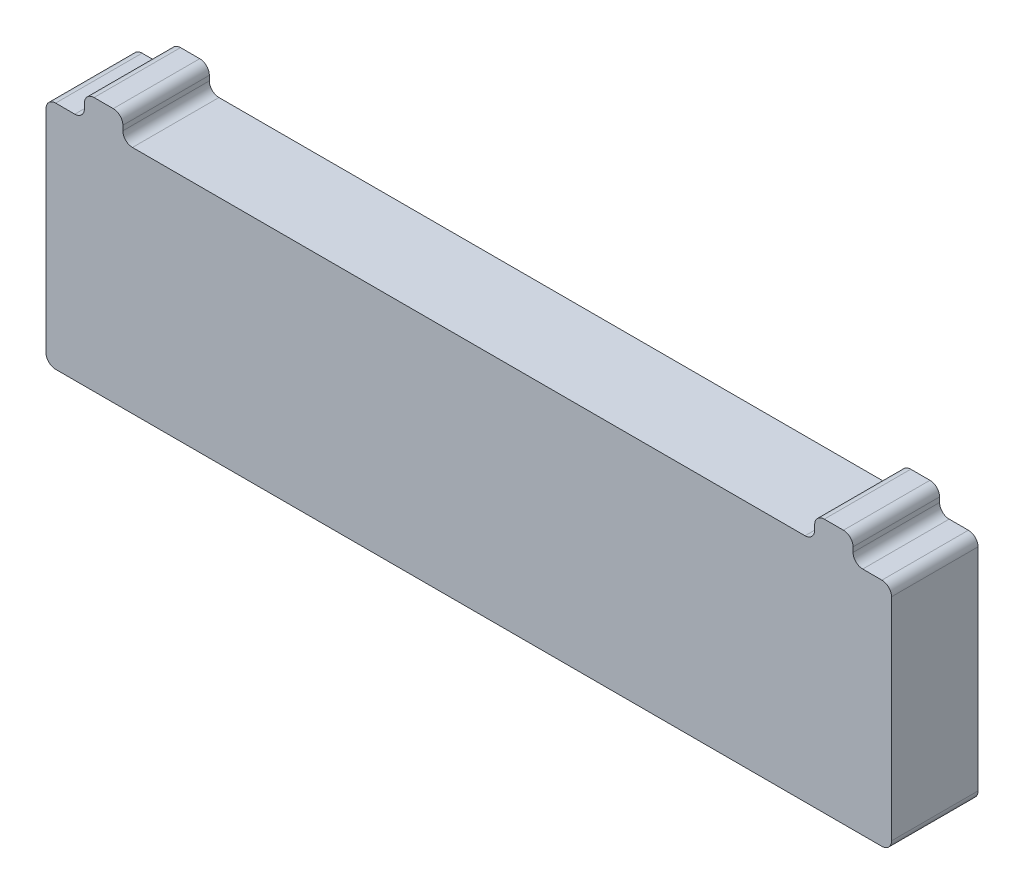
ISO-10303-21;
HEADER;
FILE_DESCRIPTION(('STEP AP214'),'2;1');
FILE_NAME('part.step','',(''),(''),'','','');
FILE_SCHEMA(('AUTOMOTIVE_DESIGN { 1 0 10303 214 1 1 1 1 }'));
ENDSEC;
DATA;
#1=APPLICATION_CONTEXT('core data for automotive mechanical design processes');
#2=APPLICATION_PROTOCOL_DEFINITION('international standard','automotive_design',2000,#1);
#3=PRODUCT_CONTEXT('',#1,'mechanical');
#4=PRODUCT('Part','Part','',(#3));
#5=PRODUCT_RELATED_PRODUCT_CATEGORY('part','',(#4));
#6=PRODUCT_DEFINITION_FORMATION('','',#4);
#7=PRODUCT_DEFINITION_CONTEXT('part definition',#1,'design');
#8=PRODUCT_DEFINITION('design','',#6,#7);
#9=PRODUCT_DEFINITION_SHAPE('','',#8);
#10=(LENGTH_UNIT() NAMED_UNIT(*) SI_UNIT(.MILLI.,.METRE.));
#11=(NAMED_UNIT(*) PLANE_ANGLE_UNIT() SI_UNIT($,.RADIAN.));
#12=(NAMED_UNIT(*) SI_UNIT($,.STERADIAN.) SOLID_ANGLE_UNIT());
#13=UNCERTAINTY_MEASURE_WITH_UNIT(LENGTH_MEASURE(1.E-05),#10,'distance_accuracy_value','');
#14=(GEOMETRIC_REPRESENTATION_CONTEXT(3) GLOBAL_UNCERTAINTY_ASSIGNED_CONTEXT((#13)) GLOBAL_UNIT_ASSIGNED_CONTEXT((#10,
#11,#12)) REPRESENTATION_CONTEXT('',''));
#15=CARTESIAN_POINT('',(0.,0.,0.));
#16=DIRECTION('',(0.,0.,1.));
#17=DIRECTION('',(1.,0.,0.));
#18=AXIS2_PLACEMENT_3D('',#15,#16,#17);
#19=CARTESIAN_POINT('',(-44.,0.,9.));
#20=DIRECTION('',(0.,-1.,0.));
#21=DIRECTION('',(0.,0.,-1.));
#22=AXIS2_PLACEMENT_3D('',#19,#20,#21);
#23=PLANE('',#22);
#24=DIRECTION('',(-1.,0.,0.));
#25=VECTOR('',#24,1.);
#26=CARTESIAN_POINT('',(-44.,0.,0.));
#27=LINE('',#26,#25);
#28=CARTESIAN_POINT('',(43.,0.,0.));
#29=VERTEX_POINT('',#28);
#30=CARTESIAN_POINT('',(41.,0.,0.));
#31=VERTEX_POINT('',#30);
#32=EDGE_CURVE('E305',#29,#31,#27,.T.);
#33=ORIENTED_EDGE('',*,*,#32,.T.);
#34=DIRECTION('',(0.,0.,1.));
#35=VECTOR('',#34,1.);
#36=CARTESIAN_POINT('',(41.,0.,9.));
#37=LINE('',#36,#35);
#38=CARTESIAN_POINT('',(41.,0.,9.));
#39=VERTEX_POINT('',#38);
#40=EDGE_CURVE('E256',#31,#39,#37,.T.);
#41=ORIENTED_EDGE('',*,*,#40,.T.);
#42=DIRECTION('',(-1.,0.,0.));
#43=VECTOR('',#42,1.);
#44=CARTESIAN_POINT('',(-44.,0.,9.));
#45=LINE('',#44,#43);
#46=CARTESIAN_POINT('',(43.,0.,9.));
#47=VERTEX_POINT('',#46);
#48=EDGE_CURVE('E206',#47,#39,#45,.T.);
#49=ORIENTED_EDGE('',*,*,#48,.F.);
#50=DIRECTION('',(0.,0.,-1.));
#51=VECTOR('',#50,1.);
#52=CARTESIAN_POINT('',(43.,0.,9.));
#53=LINE('',#52,#51);
#54=EDGE_CURVE('E253',#47,#29,#53,.T.);
#55=ORIENTED_EDGE('',*,*,#54,.T.);
#56=EDGE_LOOP('',(#33,#41,#49,#55));
#57=FACE_BOUND('',#56,.T.);
#58=ADVANCED_FACE('F32',(#57),#23,.F.);
#59=CARTESIAN_POINT('',(-41.,0.,9.));
#60=VERTEX_POINT('',#59);
#61=CARTESIAN_POINT('',(-43.,0.,9.));
#62=VERTEX_POINT('',#61);
#63=EDGE_CURVE('E334',#60,#62,#45,.T.);
#64=ORIENTED_EDGE('',*,*,#63,.F.);
#65=DIRECTION('',(0.,0.,1.));
#66=VECTOR('',#65,1.);
#67=CARTESIAN_POINT('',(-41.,0.,9.));
#68=LINE('',#67,#66);
#69=CARTESIAN_POINT('',(-41.,0.,0.));
#70=VERTEX_POINT('',#69);
#71=EDGE_CURVE('E400',#60,#70,#68,.F.);
#72=ORIENTED_EDGE('',*,*,#71,.T.);
#73=CARTESIAN_POINT('',(-43.,0.,0.));
#74=VERTEX_POINT('',#73);
#75=EDGE_CURVE('E312',#70,#74,#27,.T.);
#76=ORIENTED_EDGE('',*,*,#75,.T.);
#77=DIRECTION('',(0.,0.,-1.));
#78=VECTOR('',#77,1.);
#79=CARTESIAN_POINT('',(-43.,0.,9.));
#80=LINE('',#79,#78);
#81=EDGE_CURVE('E402',#74,#62,#80,.F.);
#82=ORIENTED_EDGE('',*,*,#81,.T.);
#83=EDGE_LOOP('',(#64,#72,#76,#82));
#84=FACE_BOUND('',#83,.T.);
#85=ADVANCED_FACE('F441',(#84),#23,.F.);
#86=CARTESIAN_POINT('',(-44.,-24.,9.));
#87=DIRECTION('',(1.,0.,0.));
#88=DIRECTION('',(0.,0.,-1.));
#89=AXIS2_PLACEMENT_3D('',#86,#87,#88);
#90=PLANE('',#89);
#91=DIRECTION('',(0.,-1.,0.));
#92=VECTOR('',#91,1.);
#93=CARTESIAN_POINT('',(-44.,-24.,0.));
#94=LINE('',#93,#92);
#95=CARTESIAN_POINT('',(-44.,-1.,0.));
#96=VERTEX_POINT('',#95);
#97=CARTESIAN_POINT('',(-44.,-23.,0.));
#98=VERTEX_POINT('',#97);
#99=EDGE_CURVE('E326',#96,#98,#94,.T.);
#100=ORIENTED_EDGE('',*,*,#99,.T.);
#101=DIRECTION('',(0.,0.,-1.));
#102=VECTOR('',#101,1.);
#103=CARTESIAN_POINT('',(-44.,-23.,9.));
#104=LINE('',#103,#102);
#105=CARTESIAN_POINT('',(-44.,-23.,9.));
#106=VERTEX_POINT('',#105);
#107=EDGE_CURVE('E271',#98,#106,#104,.F.);
#108=ORIENTED_EDGE('',*,*,#107,.T.);
#109=DIRECTION('',(0.,-1.,0.));
#110=VECTOR('',#109,1.);
#111=CARTESIAN_POINT('',(-44.,-24.,9.));
#112=LINE('',#111,#110);
#113=CARTESIAN_POINT('',(-44.,-1.,9.));
#114=VERTEX_POINT('',#113);
#115=EDGE_CURVE('E309',#114,#106,#112,.T.);
#116=ORIENTED_EDGE('',*,*,#115,.F.);
#117=DIRECTION('',(0.,0.,-1.));
#118=VECTOR('',#117,1.);
#119=CARTESIAN_POINT('',(-44.,-1.,9.));
#120=LINE('',#119,#118);
#121=EDGE_CURVE('E268',#114,#96,#120,.T.);
#122=ORIENTED_EDGE('',*,*,#121,.T.);
#123=EDGE_LOOP('',(#100,#108,#116,#122));
#124=FACE_BOUND('',#123,.T.);
#125=ADVANCED_FACE('F446',(#124),#90,.F.);
#126=CARTESIAN_POINT('',(-44.,-24.,9.));
#127=DIRECTION('',(0.,1.,0.));
#128=DIRECTION('',(0.,0.,1.));
#129=AXIS2_PLACEMENT_3D('',#126,#127,#128);
#130=PLANE('',#129);
#131=DIRECTION('',(1.,0.,0.));
#132=VECTOR('',#131,1.);
#133=CARTESIAN_POINT('',(-44.,-24.,0.));
#134=LINE('',#133,#132);
#135=CARTESIAN_POINT('',(-43.,-24.,0.));
#136=VERTEX_POINT('',#135);
#137=CARTESIAN_POINT('',(43.,-24.,0.));
#138=VERTEX_POINT('',#137);
#139=EDGE_CURVE('E323',#136,#138,#134,.T.);
#140=ORIENTED_EDGE('',*,*,#139,.T.);
#141=DIRECTION('',(0.,0.,-1.));
#142=VECTOR('',#141,1.);
#143=CARTESIAN_POINT('',(43.,-24.,9.));
#144=LINE('',#143,#142);
#145=CARTESIAN_POINT('',(43.,-24.,9.));
#146=VERTEX_POINT('',#145);
#147=EDGE_CURVE('E266',#138,#146,#144,.F.);
#148=ORIENTED_EDGE('',*,*,#147,.T.);
#149=DIRECTION('',(1.,0.,0.));
#150=VECTOR('',#149,1.);
#151=CARTESIAN_POINT('',(-44.,-24.,9.));
#152=LINE('',#151,#150);
#153=CARTESIAN_POINT('',(-43.,-24.,9.));
#154=VERTEX_POINT('',#153);
#155=EDGE_CURVE('E314',#154,#146,#152,.T.);
#156=ORIENTED_EDGE('',*,*,#155,.F.);
#157=DIRECTION('',(0.,0.,-1.));
#158=VECTOR('',#157,1.);
#159=CARTESIAN_POINT('',(-43.,-24.,9.));
#160=LINE('',#159,#158);
#161=EDGE_CURVE('E264',#154,#136,#160,.T.);
#162=ORIENTED_EDGE('',*,*,#161,.T.);
#163=EDGE_LOOP('',(#140,#148,#156,#162));
#164=FACE_BOUND('',#163,.T.);
#165=ADVANCED_FACE('F456',(#164),#130,.F.);
#166=CARTESIAN_POINT('',(44.,-24.,9.));
#167=DIRECTION('',(-1.,0.,0.));
#168=DIRECTION('',(0.,0.,1.));
#169=AXIS2_PLACEMENT_3D('',#166,#167,#168);
#170=PLANE('',#169);
#171=DIRECTION('',(0.,1.,0.));
#172=VECTOR('',#171,1.);
#173=CARTESIAN_POINT('',(44.,-24.,0.));
#174=LINE('',#173,#172);
#175=CARTESIAN_POINT('',(44.,-23.,0.));
#176=VERTEX_POINT('',#175);
#177=CARTESIAN_POINT('',(44.,-1.,0.));
#178=VERTEX_POINT('',#177);
#179=EDGE_CURVE('E319',#176,#178,#174,.T.);
#180=ORIENTED_EDGE('',*,*,#179,.T.);
#181=DIRECTION('',(0.,0.,-1.));
#182=VECTOR('',#181,1.);
#183=CARTESIAN_POINT('',(44.,-1.,9.));
#184=LINE('',#183,#182);
#185=CARTESIAN_POINT('',(44.,-1.,9.));
#186=VERTEX_POINT('',#185);
#187=EDGE_CURVE('E262',#178,#186,#184,.F.);
#188=ORIENTED_EDGE('',*,*,#187,.T.);
#189=DIRECTION('',(0.,1.,0.));
#190=VECTOR('',#189,1.);
#191=CARTESIAN_POINT('',(44.,-24.,9.));
#192=LINE('',#191,#190);
#193=CARTESIAN_POINT('',(44.,-23.,9.));
#194=VERTEX_POINT('',#193);
#195=EDGE_CURVE('E335',#194,#186,#192,.T.);
#196=ORIENTED_EDGE('',*,*,#195,.F.);
#197=DIRECTION('',(0.,0.,-1.));
#198=VECTOR('',#197,1.);
#199=CARTESIAN_POINT('',(44.,-23.,9.));
#200=LINE('',#199,#198);
#201=EDGE_CURVE('E259',#194,#176,#200,.T.);
#202=ORIENTED_EDGE('',*,*,#201,.T.);
#203=EDGE_LOOP('',(#180,#188,#196,#202));
#204=FACE_BOUND('',#203,.T.);
#205=ADVANCED_FACE('F450',(#204),#170,.F.);
#206=CARTESIAN_POINT('',(35.,0.,0.));
#207=VERTEX_POINT('',#206);
#208=CARTESIAN_POINT('',(-35.,0.,0.));
#209=VERTEX_POINT('',#208);
#210=EDGE_CURVE('E310',#207,#209,#27,.T.);
#211=ORIENTED_EDGE('',*,*,#210,.T.);
#212=DIRECTION('',(0.,0.,1.));
#213=VECTOR('',#212,1.);
#214=CARTESIAN_POINT('',(-35.,0.,9.));
#215=LINE('',#214,#213);
#216=CARTESIAN_POINT('',(-35.,0.,9.));
#217=VERTEX_POINT('',#216);
#218=EDGE_CURVE('E235',#209,#217,#215,.T.);
#219=ORIENTED_EDGE('',*,*,#218,.T.);
#220=CARTESIAN_POINT('',(35.,0.,9.));
#221=VERTEX_POINT('',#220);
#222=EDGE_CURVE('E331',#221,#217,#45,.T.);
#223=ORIENTED_EDGE('',*,*,#222,.F.);
#224=DIRECTION('',(0.,0.,1.));
#225=VECTOR('',#224,1.);
#226=CARTESIAN_POINT('',(35.,0.,9.));
#227=LINE('',#226,#225);
#228=EDGE_CURVE('E233',#221,#207,#227,.F.);
#229=ORIENTED_EDGE('',*,*,#228,.T.);
#230=EDGE_LOOP('',(#211,#219,#223,#229));
#231=FACE_BOUND('',#230,.T.);
#232=ADVANCED_FACE('F425',(#231),#23,.F.);
#233=CARTESIAN_POINT('',(0.,0.,9.));
#234=DIRECTION('',(0.,0.,-1.));
#235=DIRECTION('',(-1.,0.,0.));
#236=AXIS2_PLACEMENT_3D('',#233,#234,#235);
#237=PLANE('',#236);
#238=DIRECTION('',(-1.,0.,0.));
#239=VECTOR('',#238,1.);
#240=CARTESIAN_POINT('',(-36.,2.5,9.));
#241=LINE('',#240,#239);
#242=CARTESIAN_POINT('',(-37.,2.5,9.));
#243=VERTEX_POINT('',#242);
#244=CARTESIAN_POINT('',(-39.,2.5,9.));
#245=VERTEX_POINT('',#244);
#246=EDGE_CURVE('E346',#243,#245,#241,.T.);
#247=ORIENTED_EDGE('',*,*,#246,.T.);
#248=CARTESIAN_POINT('',(-39.,1.5,9.));
#249=DIRECTION('',(0.,0.,-1.));
#250=DIRECTION('',(-1.,0.,0.));
#251=AXIS2_PLACEMENT_3D('',#248,#249,#250);
#252=CIRCLE('',#251,1.);
#253=CARTESIAN_POINT('',(-40.,1.49999999999999,9.));
#254=VERTEX_POINT('',#253);
#255=EDGE_CURVE('E382',#245,#254,#252,.F.);
#256=ORIENTED_EDGE('',*,*,#255,.T.);
#257=DIRECTION('',(0.,-1.,0.));
#258=VECTOR('',#257,1.);
#259=CARTESIAN_POINT('',(-40.,0.,9.));
#260=LINE('',#259,#258);
#261=CARTESIAN_POINT('',(-40.,1.00000000000001,9.));
#262=VERTEX_POINT('',#261);
#263=EDGE_CURVE('E202',#254,#262,#260,.T.);
#264=ORIENTED_EDGE('',*,*,#263,.T.);
#265=CARTESIAN_POINT('',(-41.,1.,9.));
#266=DIRECTION('',(0.,0.,-1.));
#267=DIRECTION('',(-1.,0.,0.));
#268=AXIS2_PLACEMENT_3D('',#265,#266,#267);
#269=CIRCLE('',#268,1.);
#270=EDGE_CURVE('E273',#262,#60,#269,.T.);
#271=ORIENTED_EDGE('',*,*,#270,.T.);
#272=ORIENTED_EDGE('',*,*,#63,.T.);
#273=CARTESIAN_POINT('',(-43.,-1.,9.));
#274=DIRECTION('',(0.,0.,-1.));
#275=DIRECTION('',(-1.,0.,0.));
#276=AXIS2_PLACEMENT_3D('',#273,#274,#275);
#277=CIRCLE('',#276,1.);
#278=EDGE_CURVE('E395',#62,#114,#277,.F.);
#279=ORIENTED_EDGE('',*,*,#278,.T.);
#280=ORIENTED_EDGE('',*,*,#115,.T.);
#281=CARTESIAN_POINT('',(-43.,-23.,9.));
#282=DIRECTION('',(0.,0.,-1.));
#283=DIRECTION('',(-1.,0.,0.));
#284=AXIS2_PLACEMENT_3D('',#281,#282,#283);
#285=CIRCLE('',#284,1.);
#286=EDGE_CURVE('E393',#106,#154,#285,.F.);
#287=ORIENTED_EDGE('',*,*,#286,.T.);
#288=ORIENTED_EDGE('',*,*,#155,.T.);
#289=CARTESIAN_POINT('',(43.,-23.,9.));
#290=DIRECTION('',(0.,0.,-1.));
#291=DIRECTION('',(-1.,0.,0.));
#292=AXIS2_PLACEMENT_3D('',#289,#290,#291);
#293=CIRCLE('',#292,1.);
#294=EDGE_CURVE('E391',#146,#194,#293,.F.);
#295=ORIENTED_EDGE('',*,*,#294,.T.);
#296=ORIENTED_EDGE('',*,*,#195,.T.);
#297=CARTESIAN_POINT('',(43.,-1.,9.));
#298=DIRECTION('',(0.,0.,-1.));
#299=DIRECTION('',(-1.,0.,0.));
#300=AXIS2_PLACEMENT_3D('',#297,#298,#299);
#301=CIRCLE('',#300,1.);
#302=EDGE_CURVE('E389',#186,#47,#301,.F.);
#303=ORIENTED_EDGE('',*,*,#302,.T.);
#304=ORIENTED_EDGE('',*,*,#48,.T.);
#305=CARTESIAN_POINT('',(41.,1.,9.));
#306=DIRECTION('',(0.,0.,-1.));
#307=DIRECTION('',(-1.,0.,0.));
#308=AXIS2_PLACEMENT_3D('',#305,#306,#307);
#309=CIRCLE('',#308,1.);
#310=CARTESIAN_POINT('',(40.,1.00000000000001,9.));
#311=VERTEX_POINT('',#310);
#312=EDGE_CURVE('E40',#39,#311,#309,.T.);
#313=ORIENTED_EDGE('',*,*,#312,.T.);
#314=DIRECTION('',(0.,1.,0.));
#315=VECTOR('',#314,1.);
#316=CARTESIAN_POINT('',(40.,0.,9.));
#317=LINE('',#316,#315);
#318=CARTESIAN_POINT('',(40.,1.49999999999999,9.));
#319=VERTEX_POINT('',#318);
#320=EDGE_CURVE('E289',#311,#319,#317,.T.);
#321=ORIENTED_EDGE('',*,*,#320,.T.);
#322=CARTESIAN_POINT('',(39.,1.5,9.));
#323=DIRECTION('',(0.,0.,-1.));
#324=DIRECTION('',(-1.,0.,0.));
#325=AXIS2_PLACEMENT_3D('',#322,#323,#324);
#326=CIRCLE('',#325,1.);
#327=CARTESIAN_POINT('',(39.,2.5,9.));
#328=VERTEX_POINT('',#327);
#329=EDGE_CURVE('E387',#319,#328,#326,.F.);
#330=ORIENTED_EDGE('',*,*,#329,.T.);
#331=DIRECTION('',(-1.,0.,0.));
#332=VECTOR('',#331,1.);
#333=CARTESIAN_POINT('',(36.,2.5,9.));
#334=LINE('',#333,#332);
#335=CARTESIAN_POINT('',(37.,2.5,9.));
#336=VERTEX_POINT('',#335);
#337=EDGE_CURVE('E299',#328,#336,#334,.T.);
#338=ORIENTED_EDGE('',*,*,#337,.T.);
#339=CARTESIAN_POINT('',(37.,1.5,9.));
#340=DIRECTION('',(0.,0.,-1.));
#341=DIRECTION('',(-1.,0.,0.));
#342=AXIS2_PLACEMENT_3D('',#339,#340,#341);
#343=CIRCLE('',#342,1.);
#344=CARTESIAN_POINT('',(36.,1.5,9.));
#345=VERTEX_POINT('',#344);
#346=EDGE_CURVE('E362',#336,#345,#343,.F.);
#347=ORIENTED_EDGE('',*,*,#346,.T.);
#348=DIRECTION('',(0.,-1.,0.));
#349=VECTOR('',#348,1.);
#350=CARTESIAN_POINT('',(36.,0.,9.));
#351=LINE('',#350,#349);
#352=CARTESIAN_POINT('',(36.,1.,9.));
#353=VERTEX_POINT('',#352);
#354=EDGE_CURVE('E355',#345,#353,#351,.T.);
#355=ORIENTED_EDGE('',*,*,#354,.T.);
#356=CARTESIAN_POINT('',(35.,1.,9.));
#357=DIRECTION('',(0.,0.,-1.));
#358=DIRECTION('',(-1.,0.,0.));
#359=AXIS2_PLACEMENT_3D('',#356,#357,#358);
#360=CIRCLE('',#359,1.);
#361=EDGE_CURVE('E280',#353,#221,#360,.T.);
#362=ORIENTED_EDGE('',*,*,#361,.T.);
#363=ORIENTED_EDGE('',*,*,#222,.T.);
#364=CARTESIAN_POINT('',(-35.,1.,9.));
#365=DIRECTION('',(0.,0.,-1.));
#366=DIRECTION('',(-1.,0.,0.));
#367=AXIS2_PLACEMENT_3D('',#364,#365,#366);
#368=CIRCLE('',#367,1.);
#369=CARTESIAN_POINT('',(-36.,1.,9.));
#370=VERTEX_POINT('',#369);
#371=EDGE_CURVE('E276',#217,#370,#368,.T.);
#372=ORIENTED_EDGE('',*,*,#371,.T.);
#373=DIRECTION('',(0.,1.,0.));
#374=VECTOR('',#373,1.);
#375=CARTESIAN_POINT('',(-36.,0.,9.));
#376=LINE('',#375,#374);
#377=CARTESIAN_POINT('',(-36.,1.5,9.));
#378=VERTEX_POINT('',#377);
#379=EDGE_CURVE('E343',#370,#378,#376,.T.);
#380=ORIENTED_EDGE('',*,*,#379,.T.);
#381=CARTESIAN_POINT('',(-37.,1.5,9.));
#382=DIRECTION('',(0.,0.,-1.));
#383=DIRECTION('',(-1.,0.,0.));
#384=AXIS2_PLACEMENT_3D('',#381,#382,#383);
#385=CIRCLE('',#384,1.);
#386=EDGE_CURVE('E384',#378,#243,#385,.F.);
#387=ORIENTED_EDGE('',*,*,#386,.T.);
#388=EDGE_LOOP('',(#247,#256,#264,#271,#272,#279,#280,#287,#288,#295,#296,#303,#304,#313,#321,
#330,#338,#347,#355,#362,#363,#372,#380,#387));
#389=FACE_BOUND('',#388,.T.);
#390=ADVANCED_FACE('F288',(#389),#237,.F.);
#391=CARTESIAN_POINT('',(0.,0.,0.));
#392=DIRECTION('',(0.,0.,-1.));
#393=DIRECTION('',(-1.,0.,0.));
#394=AXIS2_PLACEMENT_3D('',#391,#392,#393);
#395=PLANE('',#394);
#396=DIRECTION('',(0.,-1.,0.));
#397=VECTOR('',#396,1.);
#398=CARTESIAN_POINT('',(-40.,0.,0.));
#399=LINE('',#398,#397);
#400=CARTESIAN_POINT('',(-40.,1.49999999999999,0.));
#401=VERTEX_POINT('',#400);
#402=CARTESIAN_POINT('',(-40.,1.00000000000001,0.));
#403=VERTEX_POINT('',#402);
#404=EDGE_CURVE('E199',#401,#403,#399,.T.);
#405=ORIENTED_EDGE('',*,*,#404,.F.);
#406=CARTESIAN_POINT('',(-39.,1.5,0.));
#407=DIRECTION('',(0.,0.,-1.));
#408=DIRECTION('',(-1.,0.,0.));
#409=AXIS2_PLACEMENT_3D('',#406,#407,#408);
#410=CIRCLE('',#409,1.);
#411=CARTESIAN_POINT('',(-39.,2.5,0.));
#412=VERTEX_POINT('',#411);
#413=EDGE_CURVE('E210',#401,#412,#410,.T.);
#414=ORIENTED_EDGE('',*,*,#413,.T.);
#415=DIRECTION('',(-1.,0.,0.));
#416=VECTOR('',#415,1.);
#417=CARTESIAN_POINT('',(-36.,2.5,0.));
#418=LINE('',#417,#416);
#419=CARTESIAN_POINT('',(-37.,2.5,0.));
#420=VERTEX_POINT('',#419);
#421=EDGE_CURVE('E216',#420,#412,#418,.T.);
#422=ORIENTED_EDGE('',*,*,#421,.F.);
#423=CARTESIAN_POINT('',(-37.,1.5,0.));
#424=DIRECTION('',(0.,0.,-1.));
#425=DIRECTION('',(-1.,0.,0.));
#426=AXIS2_PLACEMENT_3D('',#423,#424,#425);
#427=CIRCLE('',#426,1.);
#428=CARTESIAN_POINT('',(-36.,1.5,0.));
#429=VERTEX_POINT('',#428);
#430=EDGE_CURVE('E223',#420,#429,#427,.T.);
#431=ORIENTED_EDGE('',*,*,#430,.T.);
#432=DIRECTION('',(0.,1.,0.));
#433=VECTOR('',#432,1.);
#434=CARTESIAN_POINT('',(-36.,0.,0.));
#435=LINE('',#434,#433);
#436=CARTESIAN_POINT('',(-36.,1.,0.));
#437=VERTEX_POINT('',#436);
#438=EDGE_CURVE('E215',#437,#429,#435,.T.);
#439=ORIENTED_EDGE('',*,*,#438,.F.);
#440=CARTESIAN_POINT('',(-35.,1.,0.));
#441=DIRECTION('',(0.,0.,-1.));
#442=DIRECTION('',(-1.,0.,0.));
#443=AXIS2_PLACEMENT_3D('',#440,#441,#442);
#444=CIRCLE('',#443,1.);
#445=EDGE_CURVE('E278',#437,#209,#444,.F.);
#446=ORIENTED_EDGE('',*,*,#445,.T.);
#447=ORIENTED_EDGE('',*,*,#210,.F.);
#448=CARTESIAN_POINT('',(35.,1.,0.));
#449=DIRECTION('',(0.,0.,-1.));
#450=DIRECTION('',(-1.,0.,0.));
#451=AXIS2_PLACEMENT_3D('',#448,#449,#450);
#452=CIRCLE('',#451,1.);
#453=CARTESIAN_POINT('',(36.,1.,0.));
#454=VERTEX_POINT('',#453);
#455=EDGE_CURVE('E282',#207,#454,#452,.F.);
#456=ORIENTED_EDGE('',*,*,#455,.T.);
#457=DIRECTION('',(0.,-1.,0.));
#458=VECTOR('',#457,1.);
#459=CARTESIAN_POINT('',(36.,0.,0.));
#460=LINE('',#459,#458);
#461=CARTESIAN_POINT('',(36.,1.5,0.));
#462=VERTEX_POINT('',#461);
#463=EDGE_CURVE('E347',#462,#454,#460,.T.);
#464=ORIENTED_EDGE('',*,*,#463,.F.);
#465=CARTESIAN_POINT('',(37.,1.5,0.));
#466=DIRECTION('',(0.,0.,-1.));
#467=DIRECTION('',(-1.,0.,0.));
#468=AXIS2_PLACEMENT_3D('',#465,#466,#467);
#469=CIRCLE('',#468,1.);
#470=CARTESIAN_POINT('',(37.,2.5,0.));
#471=VERTEX_POINT('',#470);
#472=EDGE_CURVE('E227',#462,#471,#469,.T.);
#473=ORIENTED_EDGE('',*,*,#472,.T.);
#474=DIRECTION('',(-1.,0.,0.));
#475=VECTOR('',#474,1.);
#476=CARTESIAN_POINT('',(36.,2.5,0.));
#477=LINE('',#476,#475);
#478=CARTESIAN_POINT('',(39.,2.5,0.));
#479=VERTEX_POINT('',#478);
#480=EDGE_CURVE('E350',#479,#471,#477,.T.);
#481=ORIENTED_EDGE('',*,*,#480,.F.);
#482=CARTESIAN_POINT('',(39.,1.5,0.));
#483=DIRECTION('',(0.,0.,-1.));
#484=DIRECTION('',(-1.,0.,0.));
#485=AXIS2_PLACEMENT_3D('',#482,#483,#484);
#486=CIRCLE('',#485,1.);
#487=CARTESIAN_POINT('',(40.,1.49999999999999,0.));
#488=VERTEX_POINT('',#487);
#489=EDGE_CURVE('E373',#479,#488,#486,.T.);
#490=ORIENTED_EDGE('',*,*,#489,.T.);
#491=DIRECTION('',(0.,1.,0.));
#492=VECTOR('',#491,1.);
#493=CARTESIAN_POINT('',(40.,0.,0.));
#494=LINE('',#493,#492);
#495=CARTESIAN_POINT('',(40.,1.00000000000001,0.));
#496=VERTEX_POINT('',#495);
#497=EDGE_CURVE('E306',#496,#488,#494,.T.);
#498=ORIENTED_EDGE('',*,*,#497,.F.);
#499=CARTESIAN_POINT('',(41.,1.,0.));
#500=DIRECTION('',(0.,0.,-1.));
#501=DIRECTION('',(-1.,0.,0.));
#502=AXIS2_PLACEMENT_3D('',#499,#500,#501);
#503=CIRCLE('',#502,1.);
#504=EDGE_CURVE('E11',#496,#31,#503,.F.);
#505=ORIENTED_EDGE('',*,*,#504,.T.);
#506=ORIENTED_EDGE('',*,*,#32,.F.);
#507=CARTESIAN_POINT('',(43.,-1.,0.));
#508=DIRECTION('',(0.,0.,-1.));
#509=DIRECTION('',(-1.,0.,0.));
#510=AXIS2_PLACEMENT_3D('',#507,#508,#509);
#511=CIRCLE('',#510,1.);
#512=EDGE_CURVE('E374',#29,#178,#511,.T.);
#513=ORIENTED_EDGE('',*,*,#512,.T.);
#514=ORIENTED_EDGE('',*,*,#179,.F.);
#515=CARTESIAN_POINT('',(43.,-23.,0.));
#516=DIRECTION('',(0.,0.,-1.));
#517=DIRECTION('',(-1.,0.,0.));
#518=AXIS2_PLACEMENT_3D('',#515,#516,#517);
#519=CIRCLE('',#518,1.);
#520=EDGE_CURVE('E47',#176,#138,#519,.T.);
#521=ORIENTED_EDGE('',*,*,#520,.T.);
#522=ORIENTED_EDGE('',*,*,#139,.F.);
#523=CARTESIAN_POINT('',(-43.,-23.,0.));
#524=DIRECTION('',(0.,0.,-1.));
#525=DIRECTION('',(-1.,0.,0.));
#526=AXIS2_PLACEMENT_3D('',#523,#524,#525);
#527=CIRCLE('',#526,1.);
#528=EDGE_CURVE('E55',#136,#98,#527,.T.);
#529=ORIENTED_EDGE('',*,*,#528,.T.);
#530=ORIENTED_EDGE('',*,*,#99,.F.);
#531=CARTESIAN_POINT('',(-43.,-1.,0.));
#532=DIRECTION('',(0.,0.,-1.));
#533=DIRECTION('',(-1.,0.,0.));
#534=AXIS2_PLACEMENT_3D('',#531,#532,#533);
#535=CIRCLE('',#534,1.);
#536=EDGE_CURVE('E380',#96,#74,#535,.T.);
#537=ORIENTED_EDGE('',*,*,#536,.T.);
#538=ORIENTED_EDGE('',*,*,#75,.F.);
#539=CARTESIAN_POINT('',(-41.,1.,0.));
#540=DIRECTION('',(0.,0.,-1.));
#541=DIRECTION('',(-1.,0.,0.));
#542=AXIS2_PLACEMENT_3D('',#539,#540,#541);
#543=CIRCLE('',#542,1.);
#544=EDGE_CURVE('E214',#70,#403,#543,.F.);
#545=ORIENTED_EDGE('',*,*,#544,.T.);
#546=EDGE_LOOP('',(#405,#414,#422,#431,#439,#446,#447,#456,#464,#473,#481,#490,#498,#505,#506,
#513,#514,#521,#522,#529,#530,#537,#538,#545));
#547=FACE_BOUND('',#546,.T.);
#548=ADVANCED_FACE('F208',(#547),#395,.T.);
#549=CARTESIAN_POINT('',(-36.,2.5,-4.7169905660283));
#550=DIRECTION('',(0.,1.,0.));
#551=DIRECTION('',(-1.,0.,0.));
#552=AXIS2_PLACEMENT_3D('',#549,#550,#551);
#553=PLANE('',#552);
#554=ORIENTED_EDGE('',*,*,#421,.T.);
#555=DIRECTION('',(0.,0.,1.));
#556=VECTOR('',#555,1.);
#557=CARTESIAN_POINT('',(-39.,2.5,-4.7169905660283));
#558=LINE('',#557,#556);
#559=EDGE_CURVE('E221',#412,#245,#558,.T.);
#560=ORIENTED_EDGE('',*,*,#559,.T.);
#561=ORIENTED_EDGE('',*,*,#246,.F.);
#562=DIRECTION('',(0.,0.,1.));
#563=VECTOR('',#562,1.);
#564=CARTESIAN_POINT('',(-37.,2.5,-4.7169905660283));
#565=LINE('',#564,#563);
#566=EDGE_CURVE('E398',#243,#420,#565,.F.);
#567=ORIENTED_EDGE('',*,*,#566,.T.);
#568=EDGE_LOOP('',(#554,#560,#561,#567));
#569=FACE_BOUND('',#568,.T.);
#570=ADVANCED_FACE('F409',(#569),#553,.T.);
#571=CARTESIAN_POINT('',(-40.,0.,-4.7169905660283));
#572=DIRECTION('',(-1.,0.,0.));
#573=DIRECTION('',(0.,-1.,0.));
#574=AXIS2_PLACEMENT_3D('',#571,#572,#573);
#575=PLANE('',#574);
#576=ORIENTED_EDGE('',*,*,#404,.T.);
#577=DIRECTION('',(0.,0.,1.));
#578=VECTOR('',#577,1.);
#579=CARTESIAN_POINT('',(-40.,1.00000000000001,-4.7169905660283));
#580=LINE('',#579,#578);
#581=EDGE_CURVE('E205',#403,#262,#580,.T.);
#582=ORIENTED_EDGE('',*,*,#581,.T.);
#583=ORIENTED_EDGE('',*,*,#263,.F.);
#584=DIRECTION('',(0.,0.,1.));
#585=VECTOR('',#584,1.);
#586=CARTESIAN_POINT('',(-40.,1.49999999999999,-4.7169905660283));
#587=LINE('',#586,#585);
#588=EDGE_CURVE('E195',#254,#401,#587,.F.);
#589=ORIENTED_EDGE('',*,*,#588,.T.);
#590=EDGE_LOOP('',(#576,#582,#583,#589));
#591=FACE_BOUND('',#590,.T.);
#592=ADVANCED_FACE('F197',(#591),#575,.T.);
#593=CARTESIAN_POINT('',(-36.,0.,-4.7169905660283));
#594=DIRECTION('',(1.,0.,0.));
#595=DIRECTION('',(0.,0.,-1.));
#596=AXIS2_PLACEMENT_3D('',#593,#594,#595);
#597=PLANE('',#596);
#598=ORIENTED_EDGE('',*,*,#438,.T.);
#599=DIRECTION('',(0.,0.,1.));
#600=VECTOR('',#599,1.);
#601=CARTESIAN_POINT('',(-36.,1.5,-4.7169905660283));
#602=LINE('',#601,#600);
#603=EDGE_CURVE('E225',#429,#378,#602,.T.);
#604=ORIENTED_EDGE('',*,*,#603,.T.);
#605=ORIENTED_EDGE('',*,*,#379,.F.);
#606=DIRECTION('',(0.,0.,1.));
#607=VECTOR('',#606,1.);
#608=CARTESIAN_POINT('',(-36.,1.,-4.7169905660283));
#609=LINE('',#608,#607);
#610=EDGE_CURVE('E222',#370,#437,#609,.F.);
#611=ORIENTED_EDGE('',*,*,#610,.T.);
#612=EDGE_LOOP('',(#598,#604,#605,#611));
#613=FACE_BOUND('',#612,.T.);
#614=ADVANCED_FACE('F418',(#613),#597,.T.);
#615=CARTESIAN_POINT('',(40.,0.,-4.7169905660283));
#616=DIRECTION('',(1.,0.,0.));
#617=DIRECTION('',(0.,1.,0.));
#618=AXIS2_PLACEMENT_3D('',#615,#616,#617);
#619=PLANE('',#618);
#620=ORIENTED_EDGE('',*,*,#497,.T.);
#621=DIRECTION('',(0.,0.,1.));
#622=VECTOR('',#621,1.);
#623=CARTESIAN_POINT('',(40.,1.49999999999999,-4.7169905660283));
#624=LINE('',#623,#622);
#625=EDGE_CURVE('E250',#488,#319,#624,.T.);
#626=ORIENTED_EDGE('',*,*,#625,.T.);
#627=ORIENTED_EDGE('',*,*,#320,.F.);
#628=DIRECTION('',(0.,0.,1.));
#629=VECTOR('',#628,1.);
#630=CARTESIAN_POINT('',(40.,1.00000000000001,-4.7169905660283));
#631=LINE('',#630,#629);
#632=EDGE_CURVE('E248',#311,#496,#631,.F.);
#633=ORIENTED_EDGE('',*,*,#632,.T.);
#634=EDGE_LOOP('',(#620,#626,#627,#633));
#635=FACE_BOUND('',#634,.T.);
#636=ADVANCED_FACE('F296',(#635),#619,.T.);
#637=CARTESIAN_POINT('',(36.,2.5,-4.7169905660283));
#638=DIRECTION('',(0.,1.,0.));
#639=DIRECTION('',(-1.,0.,0.));
#640=AXIS2_PLACEMENT_3D('',#637,#638,#639);
#641=PLANE('',#640);
#642=ORIENTED_EDGE('',*,*,#480,.T.);
#643=DIRECTION('',(0.,0.,1.));
#644=VECTOR('',#643,1.);
#645=CARTESIAN_POINT('',(37.,2.5,-4.7169905660283));
#646=LINE('',#645,#644);
#647=EDGE_CURVE('E245',#471,#336,#646,.T.);
#648=ORIENTED_EDGE('',*,*,#647,.T.);
#649=ORIENTED_EDGE('',*,*,#337,.F.);
#650=DIRECTION('',(0.,0.,1.));
#651=VECTOR('',#650,1.);
#652=CARTESIAN_POINT('',(39.,2.5,-4.7169905660283));
#653=LINE('',#652,#651);
#654=EDGE_CURVE('E243',#328,#479,#653,.F.);
#655=ORIENTED_EDGE('',*,*,#654,.T.);
#656=EDGE_LOOP('',(#642,#648,#649,#655));
#657=FACE_BOUND('',#656,.T.);
#658=ADVANCED_FACE('F562',(#657),#641,.T.);
#659=CARTESIAN_POINT('',(36.,0.,-4.7169905660283));
#660=DIRECTION('',(-1.,0.,0.));
#661=DIRECTION('',(0.,0.,1.));
#662=AXIS2_PLACEMENT_3D('',#659,#660,#661);
#663=PLANE('',#662);
#664=ORIENTED_EDGE('',*,*,#463,.T.);
#665=DIRECTION('',(0.,0.,1.));
#666=VECTOR('',#665,1.);
#667=CARTESIAN_POINT('',(36.,1.,-4.7169905660283));
#668=LINE('',#667,#666);
#669=EDGE_CURVE('E240',#454,#353,#668,.T.);
#670=ORIENTED_EDGE('',*,*,#669,.T.);
#671=ORIENTED_EDGE('',*,*,#354,.F.);
#672=DIRECTION('',(0.,0.,1.));
#673=VECTOR('',#672,1.);
#674=CARTESIAN_POINT('',(36.,1.5,-4.7169905660283));
#675=LINE('',#674,#673);
#676=EDGE_CURVE('E238',#345,#462,#675,.F.);
#677=ORIENTED_EDGE('',*,*,#676,.T.);
#678=EDGE_LOOP('',(#664,#670,#671,#677));
#679=FACE_BOUND('',#678,.T.);
#680=ADVANCED_FACE('F365',(#679),#663,.T.);
#681=CARTESIAN_POINT('',(-41.,1.,-4.7169905660283));
#682=DIRECTION('',(0.,0.,1.));
#683=DIRECTION('',(1.,0.,0.));
#684=AXIS2_PLACEMENT_3D('',#681,#682,#683);
#685=CYLINDRICAL_SURFACE('',#684,1.);
#686=ORIENTED_EDGE('',*,*,#544,.F.);
#687=ORIENTED_EDGE('',*,*,#71,.F.);
#688=ORIENTED_EDGE('',*,*,#270,.F.);
#689=ORIENTED_EDGE('',*,*,#581,.F.);
#690=EDGE_LOOP('',(#686,#687,#688,#689));
#691=FACE_BOUND('',#690,.T.);
#692=ADVANCED_FACE('F466',(#691),#685,.F.);
#693=CARTESIAN_POINT('',(-39.,1.5,-4.7169905660283));
#694=DIRECTION('',(0.,0.,1.));
#695=DIRECTION('',(1.,0.,0.));
#696=AXIS2_PLACEMENT_3D('',#693,#694,#695);
#697=CYLINDRICAL_SURFACE('',#696,1.);
#698=ORIENTED_EDGE('',*,*,#413,.F.);
#699=ORIENTED_EDGE('',*,*,#588,.F.);
#700=ORIENTED_EDGE('',*,*,#255,.F.);
#701=ORIENTED_EDGE('',*,*,#559,.F.);
#702=EDGE_LOOP('',(#698,#699,#700,#701));
#703=FACE_BOUND('',#702,.T.);
#704=ADVANCED_FACE('F219',(#703),#697,.T.);
#705=CARTESIAN_POINT('',(-37.,1.5,-4.7169905660283));
#706=DIRECTION('',(0.,0.,1.));
#707=DIRECTION('',(1.,0.,0.));
#708=AXIS2_PLACEMENT_3D('',#705,#706,#707);
#709=CYLINDRICAL_SURFACE('',#708,1.);
#710=ORIENTED_EDGE('',*,*,#430,.F.);
#711=ORIENTED_EDGE('',*,*,#566,.F.);
#712=ORIENTED_EDGE('',*,*,#386,.F.);
#713=ORIENTED_EDGE('',*,*,#603,.F.);
#714=EDGE_LOOP('',(#710,#711,#712,#713));
#715=FACE_BOUND('',#714,.T.);
#716=ADVANCED_FACE('F415',(#715),#709,.T.);
#717=CARTESIAN_POINT('',(-35.,1.,9.));
#718=DIRECTION('',(0.,0.,1.));
#719=DIRECTION('',(1.,0.,0.));
#720=AXIS2_PLACEMENT_3D('',#717,#718,#719);
#721=CYLINDRICAL_SURFACE('',#720,1.);
#722=ORIENTED_EDGE('',*,*,#445,.F.);
#723=ORIENTED_EDGE('',*,*,#610,.F.);
#724=ORIENTED_EDGE('',*,*,#371,.F.);
#725=ORIENTED_EDGE('',*,*,#218,.F.);
#726=EDGE_LOOP('',(#722,#723,#724,#725));
#727=FACE_BOUND('',#726,.T.);
#728=ADVANCED_FACE('F423',(#727),#721,.F.);
#729=CARTESIAN_POINT('',(35.,1.,-4.7169905660283));
#730=DIRECTION('',(0.,0.,1.));
#731=DIRECTION('',(1.,0.,0.));
#732=AXIS2_PLACEMENT_3D('',#729,#730,#731);
#733=CYLINDRICAL_SURFACE('',#732,1.);
#734=ORIENTED_EDGE('',*,*,#455,.F.);
#735=ORIENTED_EDGE('',*,*,#228,.F.);
#736=ORIENTED_EDGE('',*,*,#361,.F.);
#737=ORIENTED_EDGE('',*,*,#669,.F.);
#738=EDGE_LOOP('',(#734,#735,#736,#737));
#739=FACE_BOUND('',#738,.T.);
#740=ADVANCED_FACE('F430',(#739),#733,.F.);
#741=CARTESIAN_POINT('',(37.,1.5,-4.7169905660283));
#742=DIRECTION('',(0.,0.,1.));
#743=DIRECTION('',(1.,0.,0.));
#744=AXIS2_PLACEMENT_3D('',#741,#742,#743);
#745=CYLINDRICAL_SURFACE('',#744,1.);
#746=ORIENTED_EDGE('',*,*,#472,.F.);
#747=ORIENTED_EDGE('',*,*,#676,.F.);
#748=ORIENTED_EDGE('',*,*,#346,.F.);
#749=ORIENTED_EDGE('',*,*,#647,.F.);
#750=EDGE_LOOP('',(#746,#747,#748,#749));
#751=FACE_BOUND('',#750,.T.);
#752=ADVANCED_FACE('F370',(#751),#745,.T.);
#753=CARTESIAN_POINT('',(39.,1.5,-4.7169905660283));
#754=DIRECTION('',(0.,0.,1.));
#755=DIRECTION('',(1.,0.,0.));
#756=AXIS2_PLACEMENT_3D('',#753,#754,#755);
#757=CYLINDRICAL_SURFACE('',#756,1.);
#758=ORIENTED_EDGE('',*,*,#489,.F.);
#759=ORIENTED_EDGE('',*,*,#654,.F.);
#760=ORIENTED_EDGE('',*,*,#329,.F.);
#761=ORIENTED_EDGE('',*,*,#625,.F.);
#762=EDGE_LOOP('',(#758,#759,#760,#761));
#763=FACE_BOUND('',#762,.T.);
#764=ADVANCED_FACE('F437',(#763),#757,.T.);
#765=CARTESIAN_POINT('',(41.,1.,9.));
#766=DIRECTION('',(0.,0.,1.));
#767=DIRECTION('',(1.,0.,0.));
#768=AXIS2_PLACEMENT_3D('',#765,#766,#767);
#769=CYLINDRICAL_SURFACE('',#768,1.);
#770=ORIENTED_EDGE('',*,*,#504,.F.);
#771=ORIENTED_EDGE('',*,*,#632,.F.);
#772=ORIENTED_EDGE('',*,*,#312,.F.);
#773=ORIENTED_EDGE('',*,*,#40,.F.);
#774=EDGE_LOOP('',(#770,#771,#772,#773));
#775=FACE_BOUND('',#774,.T.);
#776=ADVANCED_FACE('F302',(#775),#769,.F.);
#777=CARTESIAN_POINT('',(43.,-1.,9.));
#778=DIRECTION('',(0.,0.,-1.));
#779=DIRECTION('',(-1.,0.,0.));
#780=AXIS2_PLACEMENT_3D('',#777,#778,#779);
#781=CYLINDRICAL_SURFACE('',#780,1.);
#782=ORIENTED_EDGE('',*,*,#302,.F.);
#783=ORIENTED_EDGE('',*,*,#187,.F.);
#784=ORIENTED_EDGE('',*,*,#512,.F.);
#785=ORIENTED_EDGE('',*,*,#54,.F.);
#786=EDGE_LOOP('',(#782,#783,#784,#785));
#787=FACE_BOUND('',#786,.T.);
#788=ADVANCED_FACE('F508',(#787),#781,.T.);
#789=CARTESIAN_POINT('',(43.,-23.,9.));
#790=DIRECTION('',(0.,0.,-1.));
#791=DIRECTION('',(-1.,0.,0.));
#792=AXIS2_PLACEMENT_3D('',#789,#790,#791);
#793=CYLINDRICAL_SURFACE('',#792,1.);
#794=ORIENTED_EDGE('',*,*,#294,.F.);
#795=ORIENTED_EDGE('',*,*,#147,.F.);
#796=ORIENTED_EDGE('',*,*,#520,.F.);
#797=ORIENTED_EDGE('',*,*,#201,.F.);
#798=EDGE_LOOP('',(#794,#795,#796,#797));
#799=FACE_BOUND('',#798,.T.);
#800=ADVANCED_FACE('F517',(#799),#793,.T.);
#801=CARTESIAN_POINT('',(-43.,-23.,9.));
#802=DIRECTION('',(0.,0.,-1.));
#803=DIRECTION('',(-1.,0.,0.));
#804=AXIS2_PLACEMENT_3D('',#801,#802,#803);
#805=CYLINDRICAL_SURFACE('',#804,1.);
#806=ORIENTED_EDGE('',*,*,#286,.F.);
#807=ORIENTED_EDGE('',*,*,#107,.F.);
#808=ORIENTED_EDGE('',*,*,#528,.F.);
#809=ORIENTED_EDGE('',*,*,#161,.F.);
#810=EDGE_LOOP('',(#806,#807,#808,#809));
#811=FACE_BOUND('',#810,.T.);
#812=ADVANCED_FACE('F527',(#811),#805,.T.);
#813=CARTESIAN_POINT('',(-43.,-1.,9.));
#814=DIRECTION('',(0.,0.,-1.));
#815=DIRECTION('',(-1.,0.,0.));
#816=AXIS2_PLACEMENT_3D('',#813,#814,#815);
#817=CYLINDRICAL_SURFACE('',#816,1.);
#818=ORIENTED_EDGE('',*,*,#278,.F.);
#819=ORIENTED_EDGE('',*,*,#81,.F.);
#820=ORIENTED_EDGE('',*,*,#536,.F.);
#821=ORIENTED_EDGE('',*,*,#121,.F.);
#822=EDGE_LOOP('',(#818,#819,#820,#821));
#823=FACE_BOUND('',#822,.T.);
#824=ADVANCED_FACE('F34',(#823),#817,.T.);
#825=CLOSED_SHELL('',(#58,#85,#125,#165,#205,#232,#390,#548,#570,#592,#614,#636,#658,#680,#692,
#704,#716,#728,#740,#752,#764,#776,#788,#800,#812,#824));
#826=MANIFOLD_SOLID_BREP('B2',#825);
#827=ADVANCED_BREP_SHAPE_REPRESENTATION('',(#18,#826),#14);
#828=SHAPE_DEFINITION_REPRESENTATION(#9,#827);
ENDSEC;
END-ISO-10303-21;
